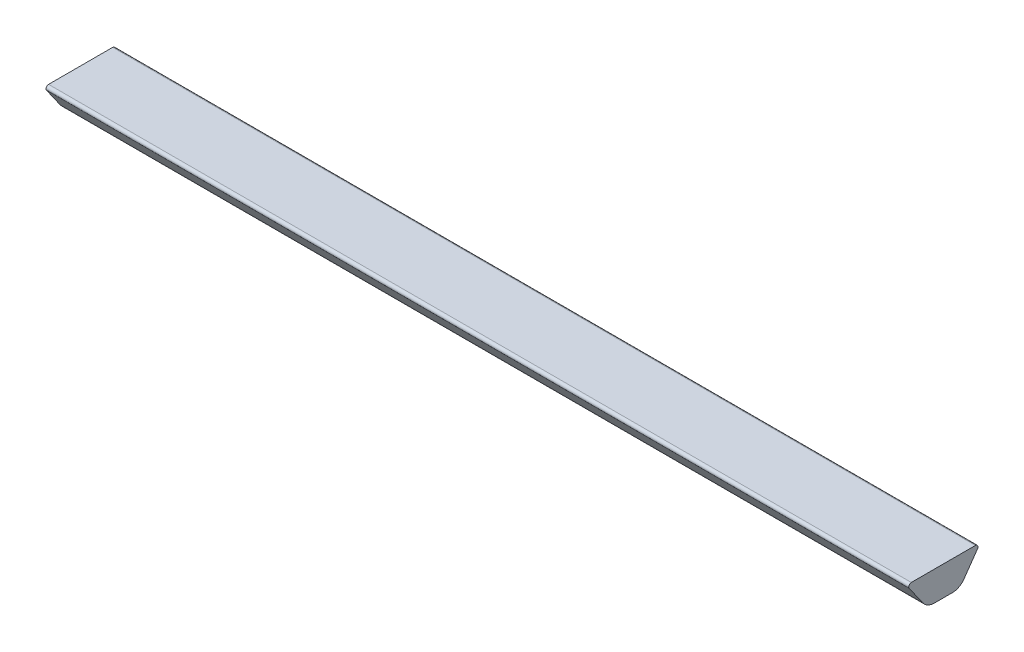
ISO-10303-21;
HEADER;
FILE_DESCRIPTION(('STEP AP214'),'2;1');
FILE_NAME('part.step','',(''),(''),'','','');
FILE_SCHEMA(('AUTOMOTIVE_DESIGN { 1 0 10303 214 1 1 1 1 }'));
ENDSEC;
DATA;
#1=APPLICATION_CONTEXT('core data for automotive mechanical design processes');
#2=APPLICATION_PROTOCOL_DEFINITION('international standard','automotive_design',2000,#1);
#3=PRODUCT_CONTEXT('',#1,'mechanical');
#4=PRODUCT('Part','Part','',(#3));
#5=PRODUCT_RELATED_PRODUCT_CATEGORY('part','',(#4));
#6=PRODUCT_DEFINITION_FORMATION('','',#4);
#7=PRODUCT_DEFINITION_CONTEXT('part definition',#1,'design');
#8=PRODUCT_DEFINITION('design','',#6,#7);
#9=PRODUCT_DEFINITION_SHAPE('','',#8);
#10=(LENGTH_UNIT() NAMED_UNIT(*) SI_UNIT(.MILLI.,.METRE.));
#11=(NAMED_UNIT(*) PLANE_ANGLE_UNIT() SI_UNIT($,.RADIAN.));
#12=(NAMED_UNIT(*) SI_UNIT($,.STERADIAN.) SOLID_ANGLE_UNIT());
#13=UNCERTAINTY_MEASURE_WITH_UNIT(LENGTH_MEASURE(1.E-05),#10,'distance_accuracy_value','');
#14=(GEOMETRIC_REPRESENTATION_CONTEXT(3) GLOBAL_UNCERTAINTY_ASSIGNED_CONTEXT((#13)) GLOBAL_UNIT_ASSIGNED_CONTEXT((#10,
#11,#12)) REPRESENTATION_CONTEXT('',''));
#15=CARTESIAN_POINT('',(0.,0.,0.));
#16=DIRECTION('',(0.,0.,1.));
#17=DIRECTION('',(1.,0.,0.));
#18=AXIS2_PLACEMENT_3D('',#15,#16,#17);
#19=CARTESIAN_POINT('',(170.165700006,-5.8542,-4.17638886546924));
#20=DIRECTION('',(0.,0.574995652232594,-0.818156464200836));
#21=DIRECTION('',(0.,0.818156464200836,0.574995652232594));
#22=AXIS2_PLACEMENT_3D('',#19,#20,#21);
#23=PLANE('',#22);
#24=DIRECTION('',(0.,-0.818156464200836,-0.574995652232594));
#25=VECTOR('',#24,1.);
#26=CARTESIAN_POINT('',(0.,-5.8542,-4.17638886546924));
#27=LINE('',#26,#25);
#28=CARTESIAN_POINT('',(0.,-0.850897791334159,-0.660096881394175));
#29=VERTEX_POINT('',#28);
#30=CARTESIAN_POINT('',(0.,-4.66673785233787,-3.34184730530026));
#31=VERTEX_POINT('',#30);
#32=EDGE_CURVE('E201',#29,#31,#27,.T.);
#33=ORIENTED_EDGE('',*,*,#32,.T.);
#34=DIRECTION('',(-1.,0.,0.));
#35=VECTOR('',#34,1.);
#36=CARTESIAN_POINT('',(170.165700006,-4.66673785233787,-3.34184730530026));
#37=LINE('',#36,#35);
#38=CARTESIAN_POINT('',(170.165700006,-4.66673785233787,-3.34184730530026));
#39=VERTEX_POINT('',#38);
#40=EDGE_CURVE('E11',#31,#39,#37,.F.);
#41=ORIENTED_EDGE('',*,*,#40,.T.);
#42=DIRECTION('',(0.,-0.818156464200836,-0.574995652232594));
#43=VECTOR('',#42,1.);
#44=CARTESIAN_POINT('',(170.165700006,-5.8542,-4.17638886546924));
#45=LINE('',#44,#43);
#46=CARTESIAN_POINT('',(170.165700006,-0.850897791334159,-0.660096881394175));
#47=VERTEX_POINT('',#46);
#48=EDGE_CURVE('E139',#47,#39,#45,.T.);
#49=ORIENTED_EDGE('',*,*,#48,.F.);
#50=DIRECTION('',(-1.,0.,0.));
#51=VECTOR('',#50,1.);
#52=CARTESIAN_POINT('',(170.165700006,-0.850897791334159,-0.660096881394175));
#53=LINE('',#52,#51);
#54=EDGE_CURVE('E162',#47,#29,#53,.T.);
#55=ORIENTED_EDGE('',*,*,#54,.T.);
#56=EDGE_LOOP('',(#33,#41,#49,#55));
#57=FACE_BOUND('',#56,.T.);
#58=ADVANCED_FACE('F43',(#57),#23,.F.);
#59=CARTESIAN_POINT('',(170.165700006,-5.8542,-10.6236111345308));
#60=DIRECTION('',(0.,1.,0.));
#61=DIRECTION('',(0.,0.,1.));
#62=AXIS2_PLACEMENT_3D('',#59,#60,#61);
#63=PLANE('',#62);
#64=DIRECTION('',(0.,0.,-1.));
#65=VECTOR('',#64,1.);
#66=CARTESIAN_POINT('',(0.,-5.8542,-10.6236111345308));
#67=LINE('',#66,#65);
#68=CARTESIAN_POINT('',(0.,-5.8542,-5.62777646627739));
#69=VERTEX_POINT('',#68);
#70=CARTESIAN_POINT('',(0.,-5.8542,-9.17222353372261));
#71=VERTEX_POINT('',#70);
#72=EDGE_CURVE('E146',#69,#71,#67,.T.);
#73=ORIENTED_EDGE('',*,*,#72,.T.);
#74=DIRECTION('',(-1.,0.,0.));
#75=VECTOR('',#74,1.);
#76=CARTESIAN_POINT('',(170.165700006,-5.8542,-9.17222353372261));
#77=LINE('',#76,#75);
#78=CARTESIAN_POINT('',(170.165700006,-5.8542,-9.17222353372261));
#79=VERTEX_POINT('',#78);
#80=EDGE_CURVE('E65',#71,#79,#77,.F.);
#81=ORIENTED_EDGE('',*,*,#80,.T.);
#82=DIRECTION('',(0.,0.,-1.));
#83=VECTOR('',#82,1.);
#84=CARTESIAN_POINT('',(170.165700006,-5.8542,-10.6236111345308));
#85=LINE('',#84,#83);
#86=CARTESIAN_POINT('',(170.165700006,-5.8542,-5.62777646627739));
#87=VERTEX_POINT('',#86);
#88=EDGE_CURVE('E144',#87,#79,#85,.T.);
#89=ORIENTED_EDGE('',*,*,#88,.F.);
#90=DIRECTION('',(-1.,0.,0.));
#91=VECTOR('',#90,1.);
#92=CARTESIAN_POINT('',(170.165700006,-5.8542,-5.62777646627739));
#93=LINE('',#92,#91);
#94=EDGE_CURVE('E176',#87,#69,#93,.T.);
#95=ORIENTED_EDGE('',*,*,#94,.T.);
#96=EDGE_LOOP('',(#73,#81,#89,#95));
#97=FACE_BOUND('',#96,.T.);
#98=ADVANCED_FACE('F198',(#97),#63,.F.);
#99=CARTESIAN_POINT('',(170.165700006,-0.0508,-14.7022072395265));
#100=DIRECTION('',(0.,0.574995652232594,0.818156464200836));
#101=DIRECTION('',(0.,-0.818156464200836,0.574995652232594));
#102=AXIS2_PLACEMENT_3D('',#99,#100,#101);
#103=PLANE('',#102);
#104=DIRECTION('',(0.,0.818156464200836,-0.574995652232594));
#105=VECTOR('',#104,1.);
#106=CARTESIAN_POINT('',(170.165700006,-0.0508,-14.7022072395265));
#107=LINE('',#106,#105);
#108=CARTESIAN_POINT('',(170.165700006,-4.66673785233787,-11.4581526946997));
#109=VERTEX_POINT('',#108);
#110=CARTESIAN_POINT('',(170.165700006,-0.850897791334157,-14.1399031186058));
#111=VERTEX_POINT('',#110);
#112=EDGE_CURVE('E189',#109,#111,#107,.T.);
#113=ORIENTED_EDGE('',*,*,#112,.F.);
#114=DIRECTION('',(-1.,0.,0.));
#115=VECTOR('',#114,1.);
#116=CARTESIAN_POINT('',(170.165700006,-4.66673785233787,-11.4581526946997));
#117=LINE('',#116,#115);
#118=CARTESIAN_POINT('',(0.,-4.66673785233787,-11.4581526946997));
#119=VERTEX_POINT('',#118);
#120=EDGE_CURVE('E166',#109,#119,#117,.T.);
#121=ORIENTED_EDGE('',*,*,#120,.T.);
#122=DIRECTION('',(0.,0.818156464200836,-0.574995652232594));
#123=VECTOR('',#122,1.);
#124=CARTESIAN_POINT('',(0.,-0.0508,-14.7022072395265));
#125=LINE('',#124,#123);
#126=CARTESIAN_POINT('',(0.,-0.850897791334157,-14.1399031186058));
#127=VERTEX_POINT('',#126);
#128=EDGE_CURVE('E140',#119,#127,#125,.T.);
#129=ORIENTED_EDGE('',*,*,#128,.T.);
#130=DIRECTION('',(-1.,0.,0.));
#131=VECTOR('',#130,1.);
#132=CARTESIAN_POINT('',(170.165700006,-0.850897791334157,-14.1399031186058));
#133=LINE('',#132,#131);
#134=EDGE_CURVE('E118',#127,#111,#133,.F.);
#135=ORIENTED_EDGE('',*,*,#134,.T.);
#136=EDGE_LOOP('',(#113,#121,#129,#135));
#137=FACE_BOUND('',#136,.T.);
#138=ADVANCED_FACE('F193',(#137),#103,.F.);
#139=CARTESIAN_POINT('',(170.165700006,-0.0508,-0.097792760473471));
#140=DIRECTION('',(0.,-1.,0.));
#141=DIRECTION('',(0.,0.,-1.));
#142=AXIS2_PLACEMENT_3D('',#139,#140,#141);
#143=PLANE('',#142);
#144=DIRECTION('',(0.,0.,1.));
#145=VECTOR('',#144,1.);
#146=CARTESIAN_POINT('',(170.165700006,-0.0508,-0.097792760473471));
#147=LINE('',#146,#145);
#148=CARTESIAN_POINT('',(170.165700006,-0.0508,-13.7242796347918));
#149=VERTEX_POINT('',#148);
#150=CARTESIAN_POINT('',(170.165700006,-0.0508,-1.0757203652082));
#151=VERTEX_POINT('',#150);
#152=EDGE_CURVE('E132',#149,#151,#147,.T.);
#153=ORIENTED_EDGE('',*,*,#152,.F.);
#154=DIRECTION('',(-1.,0.,0.));
#155=VECTOR('',#154,1.);
#156=CARTESIAN_POINT('',(170.165700006,-0.0508,-13.7242796347918));
#157=LINE('',#156,#155);
#158=CARTESIAN_POINT('',(0.,-0.0508,-13.7242796347918));
#159=VERTEX_POINT('',#158);
#160=EDGE_CURVE('E116',#149,#159,#157,.T.);
#161=ORIENTED_EDGE('',*,*,#160,.T.);
#162=DIRECTION('',(0.,0.,1.));
#163=VECTOR('',#162,1.);
#164=CARTESIAN_POINT('',(0.,-0.0508,-0.097792760473471));
#165=LINE('',#164,#163);
#166=CARTESIAN_POINT('',(0.,-0.0508,-1.0757203652082));
#167=VERTEX_POINT('',#166);
#168=EDGE_CURVE('E129',#159,#167,#165,.T.);
#169=ORIENTED_EDGE('',*,*,#168,.T.);
#170=DIRECTION('',(-1.,0.,0.));
#171=VECTOR('',#170,1.);
#172=CARTESIAN_POINT('',(170.165700006,-0.0508,-1.0757203652082));
#173=LINE('',#172,#171);
#174=EDGE_CURVE('E134',#167,#151,#173,.F.);
#175=ORIENTED_EDGE('',*,*,#174,.T.);
#176=EDGE_LOOP('',(#153,#161,#169,#175));
#177=FACE_BOUND('',#176,.T.);
#178=ADVANCED_FACE('F128',(#177),#143,.F.);
#179=CARTESIAN_POINT('',(170.165700006,0.,0.));
#180=DIRECTION('',(1.,0.,0.));
#181=DIRECTION('',(0.,0.,-1.));
#182=AXIS2_PLACEMENT_3D('',#179,#180,#181);
#183=PLANE('',#182);
#184=ORIENTED_EDGE('',*,*,#88,.T.);
#185=CARTESIAN_POINT('',(170.165700006,-3.0602,-9.17222353372261));
#186=DIRECTION('',(1.,0.,0.));
#187=DIRECTION('',(0.,0.,-1.));
#188=AXIS2_PLACEMENT_3D('',#185,#186,#187);
#189=CIRCLE('',#188,2.794);
#190=EDGE_CURVE('E52',#79,#109,#189,.T.);
#191=ORIENTED_EDGE('',*,*,#190,.T.);
#192=ORIENTED_EDGE('',*,*,#112,.T.);
#193=CARTESIAN_POINT('',(170.165700006,-0.5588,-13.7242796347918));
#194=DIRECTION('',(1.,0.,0.));
#195=DIRECTION('',(0.,0.,-1.));
#196=AXIS2_PLACEMENT_3D('',#193,#194,#195);
#197=CIRCLE('',#196,0.508);
#198=EDGE_CURVE('E159',#111,#149,#197,.T.);
#199=ORIENTED_EDGE('',*,*,#198,.T.);
#200=ORIENTED_EDGE('',*,*,#152,.T.);
#201=CARTESIAN_POINT('',(170.165700006,-0.5588,-1.0757203652082));
#202=DIRECTION('',(1.,0.,0.));
#203=DIRECTION('',(0.,0.,-1.));
#204=AXIS2_PLACEMENT_3D('',#201,#202,#203);
#205=CIRCLE('',#204,0.508);
#206=EDGE_CURVE('E156',#151,#47,#205,.T.);
#207=ORIENTED_EDGE('',*,*,#206,.T.);
#208=ORIENTED_EDGE('',*,*,#48,.T.);
#209=CARTESIAN_POINT('',(170.165700006,-3.0602,-5.62777646627739));
#210=DIRECTION('',(1.,0.,0.));
#211=DIRECTION('',(0.,0.,-1.));
#212=AXIS2_PLACEMENT_3D('',#209,#210,#211);
#213=CIRCLE('',#212,2.794);
#214=EDGE_CURVE('E182',#39,#87,#213,.T.);
#215=ORIENTED_EDGE('',*,*,#214,.T.);
#216=EDGE_LOOP('',(#184,#191,#192,#199,#200,#207,#208,#215));
#217=FACE_BOUND('',#216,.T.);
#218=ADVANCED_FACE('F188',(#217),#183,.T.);
#219=CARTESIAN_POINT('',(0.,0.,0.));
#220=DIRECTION('',(1.,0.,0.));
#221=DIRECTION('',(0.,0.,-1.));
#222=AXIS2_PLACEMENT_3D('',#219,#220,#221);
#223=PLANE('',#222);
#224=ORIENTED_EDGE('',*,*,#128,.F.);
#225=CARTESIAN_POINT('',(0.,-3.0602,-9.17222353372261));
#226=DIRECTION('',(1.,0.,0.));
#227=DIRECTION('',(0.,0.,-1.));
#228=AXIS2_PLACEMENT_3D('',#225,#226,#227);
#229=CIRCLE('',#228,2.794);
#230=EDGE_CURVE('E173',#119,#71,#229,.F.);
#231=ORIENTED_EDGE('',*,*,#230,.T.);
#232=ORIENTED_EDGE('',*,*,#72,.F.);
#233=CARTESIAN_POINT('',(0.,-3.0602,-5.62777646627739));
#234=DIRECTION('',(1.,0.,0.));
#235=DIRECTION('',(0.,0.,-1.));
#236=AXIS2_PLACEMENT_3D('',#233,#234,#235);
#237=CIRCLE('',#236,2.794);
#238=EDGE_CURVE('E170',#69,#31,#237,.F.);
#239=ORIENTED_EDGE('',*,*,#238,.T.);
#240=ORIENTED_EDGE('',*,*,#32,.F.);
#241=CARTESIAN_POINT('',(0.,-0.5588,-1.0757203652082));
#242=DIRECTION('',(1.,0.,0.));
#243=DIRECTION('',(0.,0.,-1.));
#244=AXIS2_PLACEMENT_3D('',#241,#242,#243);
#245=CIRCLE('',#244,0.508);
#246=EDGE_CURVE('E123',#29,#167,#245,.F.);
#247=ORIENTED_EDGE('',*,*,#246,.T.);
#248=ORIENTED_EDGE('',*,*,#168,.F.);
#249=CARTESIAN_POINT('',(0.,-0.5588,-13.7242796347918));
#250=DIRECTION('',(1.,0.,0.));
#251=DIRECTION('',(0.,0.,-1.));
#252=AXIS2_PLACEMENT_3D('',#249,#250,#251);
#253=CIRCLE('',#252,0.508);
#254=EDGE_CURVE('E112',#159,#127,#253,.F.);
#255=ORIENTED_EDGE('',*,*,#254,.T.);
#256=EDGE_LOOP('',(#224,#231,#232,#239,#240,#247,#248,#255));
#257=FACE_BOUND('',#256,.T.);
#258=ADVANCED_FACE('F136',(#257),#223,.F.);
#259=CARTESIAN_POINT('',(170.165700006,-0.5588,-13.7242796347918));
#260=DIRECTION('',(-1.,0.,0.));
#261=DIRECTION('',(0.,0.,1.));
#262=AXIS2_PLACEMENT_3D('',#259,#260,#261);
#263=CYLINDRICAL_SURFACE('',#262,0.508);
#264=ORIENTED_EDGE('',*,*,#198,.F.);
#265=ORIENTED_EDGE('',*,*,#134,.F.);
#266=ORIENTED_EDGE('',*,*,#254,.F.);
#267=ORIENTED_EDGE('',*,*,#160,.F.);
#268=EDGE_LOOP('',(#264,#265,#266,#267));
#269=FACE_BOUND('',#268,.T.);
#270=ADVANCED_FACE('F115',(#269),#263,.T.);
#271=CARTESIAN_POINT('',(170.165700006,-0.5588,-1.0757203652082));
#272=DIRECTION('',(-1.,0.,0.));
#273=DIRECTION('',(0.,0.,1.));
#274=AXIS2_PLACEMENT_3D('',#271,#272,#273);
#275=CYLINDRICAL_SURFACE('',#274,0.508);
#276=ORIENTED_EDGE('',*,*,#206,.F.);
#277=ORIENTED_EDGE('',*,*,#174,.F.);
#278=ORIENTED_EDGE('',*,*,#246,.F.);
#279=ORIENTED_EDGE('',*,*,#54,.F.);
#280=EDGE_LOOP('',(#276,#277,#278,#279));
#281=FACE_BOUND('',#280,.T.);
#282=ADVANCED_FACE('F211',(#281),#275,.T.);
#283=CARTESIAN_POINT('',(170.165700006,-3.0602,-9.17222353372261));
#284=DIRECTION('',(-1.,0.,0.));
#285=DIRECTION('',(0.,0.,1.));
#286=AXIS2_PLACEMENT_3D('',#283,#284,#285);
#287=CYLINDRICAL_SURFACE('',#286,2.794);
#288=ORIENTED_EDGE('',*,*,#190,.F.);
#289=ORIENTED_EDGE('',*,*,#80,.F.);
#290=ORIENTED_EDGE('',*,*,#230,.F.);
#291=ORIENTED_EDGE('',*,*,#120,.F.);
#292=EDGE_LOOP('',(#288,#289,#290,#291));
#293=FACE_BOUND('',#292,.T.);
#294=ADVANCED_FACE('F196',(#293),#287,.T.);
#295=CARTESIAN_POINT('',(170.165700006,-3.0602,-5.62777646627739));
#296=DIRECTION('',(-1.,0.,0.));
#297=DIRECTION('',(0.,0.,1.));
#298=AXIS2_PLACEMENT_3D('',#295,#296,#297);
#299=CYLINDRICAL_SURFACE('',#298,2.794);
#300=ORIENTED_EDGE('',*,*,#214,.F.);
#301=ORIENTED_EDGE('',*,*,#40,.F.);
#302=ORIENTED_EDGE('',*,*,#238,.F.);
#303=ORIENTED_EDGE('',*,*,#94,.F.);
#304=EDGE_LOOP('',(#300,#301,#302,#303));
#305=FACE_BOUND('',#304,.T.);
#306=ADVANCED_FACE('F45',(#305),#299,.T.);
#307=CLOSED_SHELL('',(#58,#98,#138,#178,#218,#258,#270,#282,#294,#306));
#308=MANIFOLD_SOLID_BREP('B2',#307);
#309=ADVANCED_BREP_SHAPE_REPRESENTATION('',(#18,#308),#14);
#310=SHAPE_DEFINITION_REPRESENTATION(#9,#309);
ENDSEC;
END-ISO-10303-21;
